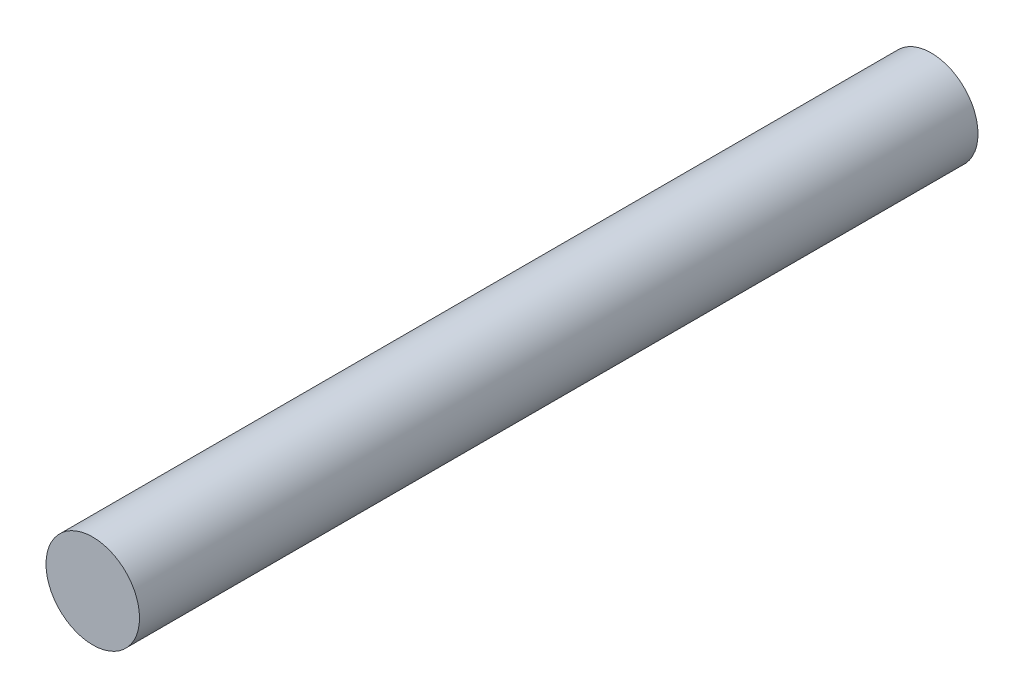
ISO-10303-21;
HEADER;
FILE_DESCRIPTION(('STEP AP214'),'2;1');
FILE_NAME('part.step','',(''),(''),'','','');
FILE_SCHEMA(('AUTOMOTIVE_DESIGN { 1 0 10303 214 1 1 1 1 }'));
ENDSEC;
DATA;
#1=APPLICATION_CONTEXT('core data for automotive mechanical design processes');
#2=APPLICATION_PROTOCOL_DEFINITION('international standard','automotive_design',2000,#1);
#3=PRODUCT_CONTEXT('',#1,'mechanical');
#4=PRODUCT('Part','Part','',(#3));
#5=PRODUCT_RELATED_PRODUCT_CATEGORY('part','',(#4));
#6=PRODUCT_DEFINITION_FORMATION('','',#4);
#7=PRODUCT_DEFINITION_CONTEXT('part definition',#1,'design');
#8=PRODUCT_DEFINITION('design','',#6,#7);
#9=PRODUCT_DEFINITION_SHAPE('','',#8);
#10=(LENGTH_UNIT() NAMED_UNIT(*) SI_UNIT(.MILLI.,.METRE.));
#11=(NAMED_UNIT(*) PLANE_ANGLE_UNIT() SI_UNIT($,.RADIAN.));
#12=(NAMED_UNIT(*) SI_UNIT($,.STERADIAN.) SOLID_ANGLE_UNIT());
#13=UNCERTAINTY_MEASURE_WITH_UNIT(LENGTH_MEASURE(1.E-05),#10,'distance_accuracy_value','');
#14=(GEOMETRIC_REPRESENTATION_CONTEXT(3) GLOBAL_UNCERTAINTY_ASSIGNED_CONTEXT((#13)) GLOBAL_UNIT_ASSIGNED_CONTEXT((#10,
#11,#12)) REPRESENTATION_CONTEXT('',''));
#15=CARTESIAN_POINT('',(0.,0.,0.));
#16=DIRECTION('',(0.,0.,1.));
#17=DIRECTION('',(1.,0.,0.));
#18=AXIS2_PLACEMENT_3D('',#15,#16,#17);
#19=CARTESIAN_POINT('',(0.,0.,14.3461667354036));
#20=DIRECTION('',(0.,0.,1.));
#21=DIRECTION('',(1.,0.,0.));
#22=AXIS2_PLACEMENT_3D('',#19,#20,#21);
#23=PLANE('',#22);
#24=CARTESIAN_POINT('',(0.,0.,14.3461667354036));
#25=DIRECTION('',(0.,0.,-1.));
#26=DIRECTION('',(-1.,0.,0.));
#27=AXIS2_PLACEMENT_3D('',#24,#25,#26);
#28=CIRCLE('',#27,1.6);
#29=CARTESIAN_POINT('',(-1.6,0.,14.3461667354036));
#30=VERTEX_POINT('',#29);
#31=EDGE_CURVE('E9',#30,#30,#28,.T.);
#32=ORIENTED_EDGE('',*,*,#31,.F.);
#33=EDGE_LOOP('',(#32));
#34=FACE_BOUND('',#33,.T.);
#35=ADVANCED_FACE('F14',(#34),#23,.T.);
#36=CARTESIAN_POINT('',(0.,0.,-14.3461667354036));
#37=DIRECTION('',(0.,0.,-1.));
#38=DIRECTION('',(-1.,0.,0.));
#39=AXIS2_PLACEMENT_3D('',#36,#37,#38);
#40=PLANE('',#39);
#41=CARTESIAN_POINT('',(0.,0.,-14.3461667354036));
#42=DIRECTION('',(0.,0.,1.));
#43=DIRECTION('',(1.,0.,0.));
#44=AXIS2_PLACEMENT_3D('',#41,#42,#43);
#45=CIRCLE('',#44,1.6);
#46=CARTESIAN_POINT('',(1.6,0.,-14.3461667354036));
#47=VERTEX_POINT('',#46);
#48=EDGE_CURVE('E21',#47,#47,#45,.T.);
#49=ORIENTED_EDGE('',*,*,#48,.F.);
#50=EDGE_LOOP('',(#49));
#51=FACE_BOUND('',#50,.T.);
#52=ADVANCED_FACE('F29',(#51),#40,.T.);
#53=CARTESIAN_POINT('',(0.,0.,-14.3461667354036));
#54=DIRECTION('',(0.,0.,1.));
#55=DIRECTION('',(1.,0.,0.));
#56=AXIS2_PLACEMENT_3D('',#53,#54,#55);
#57=CYLINDRICAL_SURFACE('',#56,1.6);
#58=ORIENTED_EDGE('',*,*,#31,.T.);
#59=EDGE_LOOP('',(#58));
#60=FACE_BOUND('',#59,.T.);
#61=ORIENTED_EDGE('',*,*,#48,.T.);
#62=EDGE_LOOP('',(#61));
#63=FACE_BOUND('',#62,.T.);
#64=ADVANCED_FACE('F16',(#60,#63),#57,.T.);
#65=CLOSED_SHELL('',(#35,#52,#64));
#66=MANIFOLD_SOLID_BREP('B1',#65);
#67=ADVANCED_BREP_SHAPE_REPRESENTATION('',(#18,#66),#14);
#68=SHAPE_DEFINITION_REPRESENTATION(#9,#67);
ENDSEC;
END-ISO-10303-21;
